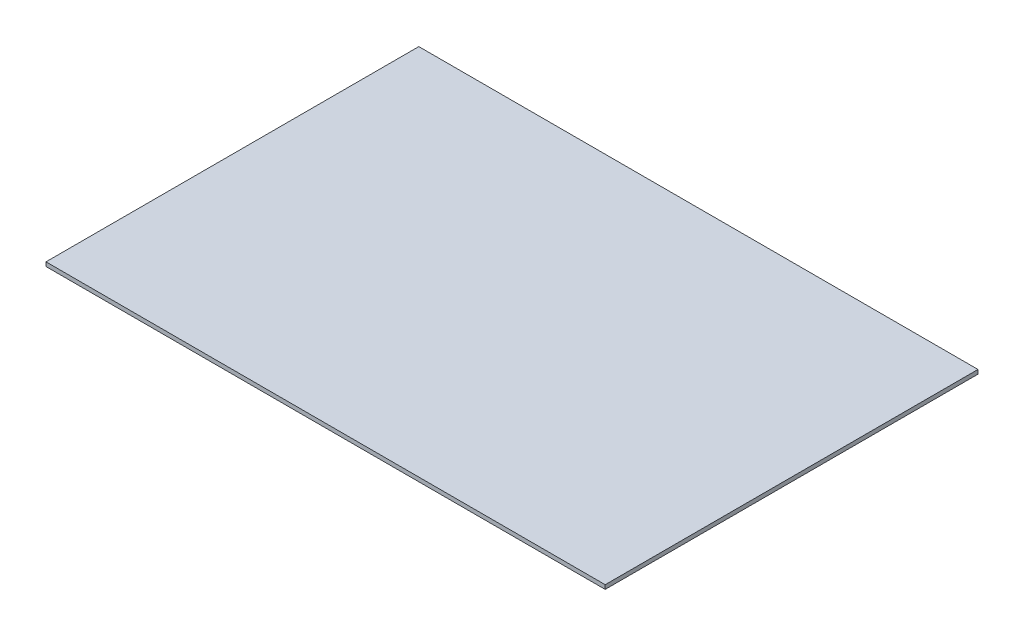
ISO-10303-21;
HEADER;
FILE_DESCRIPTION(('STEP AP214'),'2;1');
FILE_NAME('part.step','',(''),(''),'','','');
FILE_SCHEMA(('AUTOMOTIVE_DESIGN { 1 0 10303 214 1 1 1 1 }'));
ENDSEC;
DATA;
#1=APPLICATION_CONTEXT('core data for automotive mechanical design processes');
#2=APPLICATION_PROTOCOL_DEFINITION('international standard','automotive_design',2000,#1);
#3=PRODUCT_CONTEXT('',#1,'mechanical');
#4=PRODUCT('Part','Part','',(#3));
#5=PRODUCT_RELATED_PRODUCT_CATEGORY('part','',(#4));
#6=PRODUCT_DEFINITION_FORMATION('','',#4);
#7=PRODUCT_DEFINITION_CONTEXT('part definition',#1,'design');
#8=PRODUCT_DEFINITION('design','',#6,#7);
#9=PRODUCT_DEFINITION_SHAPE('','',#8);
#10=(LENGTH_UNIT() NAMED_UNIT(*) SI_UNIT(.MILLI.,.METRE.));
#11=(NAMED_UNIT(*) PLANE_ANGLE_UNIT() SI_UNIT($,.RADIAN.));
#12=(NAMED_UNIT(*) SI_UNIT($,.STERADIAN.) SOLID_ANGLE_UNIT());
#13=UNCERTAINTY_MEASURE_WITH_UNIT(LENGTH_MEASURE(1.E-05),#10,'distance_accuracy_value','');
#14=(GEOMETRIC_REPRESENTATION_CONTEXT(3) GLOBAL_UNCERTAINTY_ASSIGNED_CONTEXT((#13)) GLOBAL_UNIT_ASSIGNED_CONTEXT((#10,
#11,#12)) REPRESENTATION_CONTEXT('',''));
#15=CARTESIAN_POINT('',(0.,0.,0.));
#16=DIRECTION('',(0.,0.,1.));
#17=DIRECTION('',(1.,0.,0.));
#18=AXIS2_PLACEMENT_3D('',#15,#16,#17);
#19=CARTESIAN_POINT('',(1500.,0.,1000.));
#20=DIRECTION('',(0.,1.,0.));
#21=DIRECTION('',(1.,0.,0.));
#22=AXIS2_PLACEMENT_3D('',#19,#20,#21);
#23=PLANE('',#22);
#24=DIRECTION('',(-1.,0.,0.));
#25=VECTOR('',#24,1.);
#26=CARTESIAN_POINT('',(3000.,0.,2000.));
#27=LINE('',#26,#25);
#28=CARTESIAN_POINT('',(3000.,0.,2000.));
#29=VERTEX_POINT('',#28);
#30=CARTESIAN_POINT('',(0.,0.,2000.));
#31=VERTEX_POINT('',#30);
#32=EDGE_CURVE('E20',#29,#31,#27,.T.);
#33=ORIENTED_EDGE('',*,*,#32,.T.);
#34=DIRECTION('',(0.,0.,-1.));
#35=VECTOR('',#34,1.);
#36=CARTESIAN_POINT('',(0.,0.,2000.));
#37=LINE('',#36,#35);
#38=CARTESIAN_POINT('',(0.,0.,0.));
#39=VERTEX_POINT('',#38);
#40=EDGE_CURVE('E95',#31,#39,#37,.T.);
#41=ORIENTED_EDGE('',*,*,#40,.T.);
#42=DIRECTION('',(1.,0.,0.));
#43=VECTOR('',#42,1.);
#44=CARTESIAN_POINT('',(0.,0.,0.));
#45=LINE('',#44,#43);
#46=CARTESIAN_POINT('',(3000.,0.,0.));
#47=VERTEX_POINT('',#46);
#48=EDGE_CURVE('E78',#39,#47,#45,.T.);
#49=ORIENTED_EDGE('',*,*,#48,.T.);
#50=DIRECTION('',(0.,0.,1.));
#51=VECTOR('',#50,1.);
#52=CARTESIAN_POINT('',(3000.,0.,0.));
#53=LINE('',#52,#51);
#54=EDGE_CURVE('E98',#47,#29,#53,.T.);
#55=ORIENTED_EDGE('',*,*,#54,.T.);
#56=EDGE_LOOP('',(#33,#41,#49,#55));
#57=FACE_BOUND('',#56,.T.);
#58=ADVANCED_FACE('F16',(#57),#23,.F.);
#59=CARTESIAN_POINT('',(1500.,22.,1000.));
#60=DIRECTION('',(0.,1.,0.));
#61=DIRECTION('',(1.,0.,0.));
#62=AXIS2_PLACEMENT_3D('',#59,#60,#61);
#63=PLANE('',#62);
#64=DIRECTION('',(1.,0.,0.));
#65=VECTOR('',#64,1.);
#66=CARTESIAN_POINT('',(3000.,22.,2000.));
#67=LINE('',#66,#65);
#68=CARTESIAN_POINT('',(0.,22.,2000.));
#69=VERTEX_POINT('',#68);
#70=CARTESIAN_POINT('',(3000.,22.,2000.));
#71=VERTEX_POINT('',#70);
#72=EDGE_CURVE('E11',#69,#71,#67,.T.);
#73=ORIENTED_EDGE('',*,*,#72,.T.);
#74=DIRECTION('',(0.,0.,-1.));
#75=VECTOR('',#74,1.);
#76=CARTESIAN_POINT('',(3000.,22.,0.));
#77=LINE('',#76,#75);
#78=CARTESIAN_POINT('',(3000.,22.,0.));
#79=VERTEX_POINT('',#78);
#80=EDGE_CURVE('E72',#71,#79,#77,.T.);
#81=ORIENTED_EDGE('',*,*,#80,.T.);
#82=DIRECTION('',(-1.,0.,0.));
#83=VECTOR('',#82,1.);
#84=CARTESIAN_POINT('',(0.,22.,0.));
#85=LINE('',#84,#83);
#86=CARTESIAN_POINT('',(0.,22.,0.));
#87=VERTEX_POINT('',#86);
#88=EDGE_CURVE('E65',#79,#87,#85,.T.);
#89=ORIENTED_EDGE('',*,*,#88,.T.);
#90=DIRECTION('',(0.,0.,1.));
#91=VECTOR('',#90,1.);
#92=CARTESIAN_POINT('',(0.,22.,2000.));
#93=LINE('',#92,#91);
#94=EDGE_CURVE('E69',#87,#69,#93,.T.);
#95=ORIENTED_EDGE('',*,*,#94,.T.);
#96=EDGE_LOOP('',(#73,#81,#89,#95));
#97=FACE_BOUND('',#96,.T.);
#98=ADVANCED_FACE('F67',(#97),#63,.T.);
#99=CARTESIAN_POINT('',(0.,0.,2000.));
#100=DIRECTION('',(0.,0.,1.));
#101=DIRECTION('',(1.,0.,0.));
#102=AXIS2_PLACEMENT_3D('',#99,#100,#101);
#103=PLANE('',#102);
#104=ORIENTED_EDGE('',*,*,#32,.F.);
#105=DIRECTION('',(0.,1.,0.));
#106=VECTOR('',#105,1.);
#107=CARTESIAN_POINT('',(3000.,0.,2000.));
#108=LINE('',#107,#106);
#109=EDGE_CURVE('E102',#29,#71,#108,.T.);
#110=ORIENTED_EDGE('',*,*,#109,.T.);
#111=ORIENTED_EDGE('',*,*,#72,.F.);
#112=DIRECTION('',(0.,1.,0.));
#113=VECTOR('',#112,1.);
#114=CARTESIAN_POINT('',(0.,0.,2000.));
#115=LINE('',#114,#113);
#116=EDGE_CURVE('E88',#31,#69,#115,.T.);
#117=ORIENTED_EDGE('',*,*,#116,.F.);
#118=EDGE_LOOP('',(#104,#110,#111,#117));
#119=FACE_BOUND('',#118,.T.);
#120=ADVANCED_FACE('F155',(#119),#103,.T.);
#121=CARTESIAN_POINT('',(3000.,0.,2000.));
#122=DIRECTION('',(1.,0.,0.));
#123=DIRECTION('',(0.,1.,0.));
#124=AXIS2_PLACEMENT_3D('',#121,#122,#123);
#125=PLANE('',#124);
#126=ORIENTED_EDGE('',*,*,#54,.F.);
#127=DIRECTION('',(0.,1.,0.));
#128=VECTOR('',#127,1.);
#129=CARTESIAN_POINT('',(3000.,0.,0.));
#130=LINE('',#129,#128);
#131=EDGE_CURVE('E77',#47,#79,#130,.T.);
#132=ORIENTED_EDGE('',*,*,#131,.T.);
#133=ORIENTED_EDGE('',*,*,#80,.F.);
#134=ORIENTED_EDGE('',*,*,#109,.F.);
#135=EDGE_LOOP('',(#126,#132,#133,#134));
#136=FACE_BOUND('',#135,.T.);
#137=ADVANCED_FACE('F157',(#136),#125,.T.);
#138=CARTESIAN_POINT('',(3000.,0.,0.));
#139=DIRECTION('',(0.,0.,-1.));
#140=DIRECTION('',(0.,-1.,0.));
#141=AXIS2_PLACEMENT_3D('',#138,#139,#140);
#142=PLANE('',#141);
#143=ORIENTED_EDGE('',*,*,#48,.F.);
#144=DIRECTION('',(0.,1.,0.));
#145=VECTOR('',#144,1.);
#146=CARTESIAN_POINT('',(0.,0.,0.));
#147=LINE('',#146,#145);
#148=EDGE_CURVE('E81',#39,#87,#147,.T.);
#149=ORIENTED_EDGE('',*,*,#148,.T.);
#150=ORIENTED_EDGE('',*,*,#88,.F.);
#151=ORIENTED_EDGE('',*,*,#131,.F.);
#152=EDGE_LOOP('',(#143,#149,#150,#151));
#153=FACE_BOUND('',#152,.T.);
#154=ADVANCED_FACE('F18',(#153),#142,.T.);
#155=CARTESIAN_POINT('',(0.,0.,0.));
#156=DIRECTION('',(-1.,0.,0.));
#157=DIRECTION('',(0.,0.,1.));
#158=AXIS2_PLACEMENT_3D('',#155,#156,#157);
#159=PLANE('',#158);
#160=ORIENTED_EDGE('',*,*,#40,.F.);
#161=ORIENTED_EDGE('',*,*,#116,.T.);
#162=ORIENTED_EDGE('',*,*,#94,.F.);
#163=ORIENTED_EDGE('',*,*,#148,.F.);
#164=EDGE_LOOP('',(#160,#161,#162,#163));
#165=FACE_BOUND('',#164,.T.);
#166=ADVANCED_FACE('F87',(#165),#159,.T.);
#167=CLOSED_SHELL('',(#58,#98,#120,#137,#154,#166));
#168=MANIFOLD_SOLID_BREP('B1',#167);
#169=ADVANCED_BREP_SHAPE_REPRESENTATION('',(#18,#168),#14);
#170=SHAPE_DEFINITION_REPRESENTATION(#9,#169);
ENDSEC;
END-ISO-10303-21;
